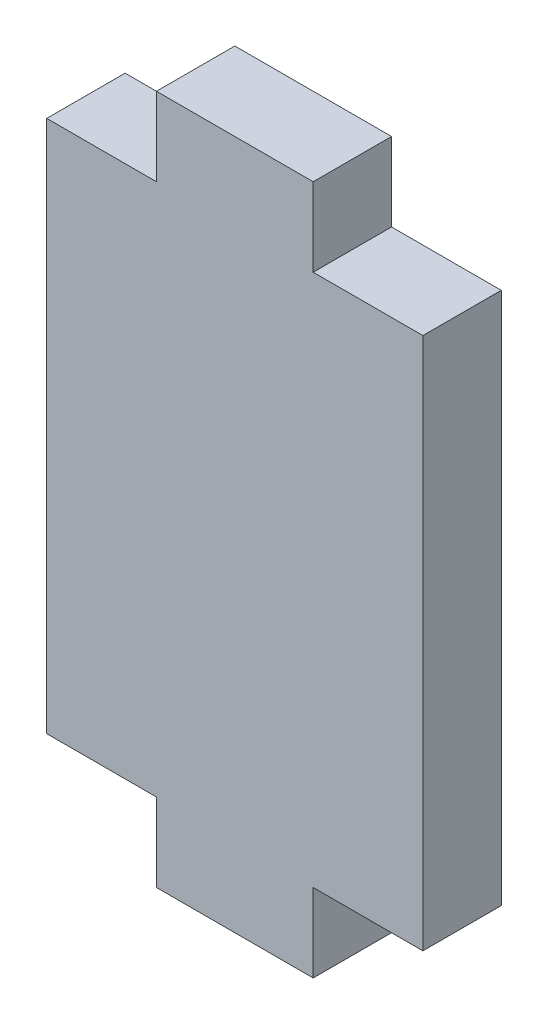
ISO-10303-21;
HEADER;
FILE_DESCRIPTION(('STEP AP214'),'2;1');
FILE_NAME('part.step','',(''),(''),'','','');
FILE_SCHEMA(('AUTOMOTIVE_DESIGN { 1 0 10303 214 1 1 1 1 }'));
ENDSEC;
DATA;
#1=APPLICATION_CONTEXT('core data for automotive mechanical design processes');
#2=APPLICATION_PROTOCOL_DEFINITION('international standard','automotive_design',2000,#1);
#3=PRODUCT_CONTEXT('',#1,'mechanical');
#4=PRODUCT('Part','Part','',(#3));
#5=PRODUCT_RELATED_PRODUCT_CATEGORY('part','',(#4));
#6=PRODUCT_DEFINITION_FORMATION('','',#4);
#7=PRODUCT_DEFINITION_CONTEXT('part definition',#1,'design');
#8=PRODUCT_DEFINITION('design','',#6,#7);
#9=PRODUCT_DEFINITION_SHAPE('','',#8);
#10=(LENGTH_UNIT() NAMED_UNIT(*) SI_UNIT(.MILLI.,.METRE.));
#11=(NAMED_UNIT(*) PLANE_ANGLE_UNIT() SI_UNIT($,.RADIAN.));
#12=(NAMED_UNIT(*) SI_UNIT($,.STERADIAN.) SOLID_ANGLE_UNIT());
#13=UNCERTAINTY_MEASURE_WITH_UNIT(LENGTH_MEASURE(1.E-05),#10,'distance_accuracy_value','');
#14=(GEOMETRIC_REPRESENTATION_CONTEXT(3) GLOBAL_UNCERTAINTY_ASSIGNED_CONTEXT((#13)) GLOBAL_UNIT_ASSIGNED_CONTEXT((#10,
#11,#12)) REPRESENTATION_CONTEXT('',''));
#15=CARTESIAN_POINT('',(0.,0.,0.));
#16=DIRECTION('',(0.,0.,1.));
#17=DIRECTION('',(1.,0.,0.));
#18=AXIS2_PLACEMENT_3D('',#15,#16,#17);
#19=CARTESIAN_POINT('',(24.,44.,10.));
#20=DIRECTION('',(-1.,0.,0.));
#21=DIRECTION('',(0.,-1.,0.));
#22=AXIS2_PLACEMENT_3D('',#19,#20,#21);
#23=PLANE('',#22);
#24=DIRECTION('',(0.,1.,0.));
#25=VECTOR('',#24,1.);
#26=CARTESIAN_POINT('',(24.,44.,10.));
#27=LINE('',#26,#25);
#28=CARTESIAN_POINT('',(24.,-34.,10.));
#29=VERTEX_POINT('',#28);
#30=CARTESIAN_POINT('',(24.,34.,10.));
#31=VERTEX_POINT('',#30);
#32=EDGE_CURVE('E149',#29,#31,#27,.T.);
#33=ORIENTED_EDGE('',*,*,#32,.F.);
#34=DIRECTION('',(0.,0.,-1.));
#35=VECTOR('',#34,1.);
#36=CARTESIAN_POINT('',(24.,-34.,10.));
#37=LINE('',#36,#35);
#38=CARTESIAN_POINT('',(24.,-34.,0.));
#39=VERTEX_POINT('',#38);
#40=EDGE_CURVE('E184',#29,#39,#37,.T.);
#41=ORIENTED_EDGE('',*,*,#40,.T.);
#42=DIRECTION('',(0.,1.,0.));
#43=VECTOR('',#42,1.);
#44=CARTESIAN_POINT('',(24.,44.,0.));
#45=LINE('',#44,#43);
#46=CARTESIAN_POINT('',(24.,34.,0.));
#47=VERTEX_POINT('',#46);
#48=EDGE_CURVE('E196',#39,#47,#45,.T.);
#49=ORIENTED_EDGE('',*,*,#48,.T.);
#50=DIRECTION('',(0.,0.,1.));
#51=VECTOR('',#50,1.);
#52=CARTESIAN_POINT('',(24.,34.,10.));
#53=LINE('',#52,#51);
#54=EDGE_CURVE('E182',#47,#31,#53,.T.);
#55=ORIENTED_EDGE('',*,*,#54,.T.);
#56=EDGE_LOOP('',(#33,#41,#49,#55));
#57=FACE_BOUND('',#56,.T.);
#58=ADVANCED_FACE('F33',(#57),#23,.F.);
#59=CARTESIAN_POINT('',(-24.,44.,10.));
#60=DIRECTION('',(0.,-1.,0.));
#61=DIRECTION('',(0.,0.,-1.));
#62=AXIS2_PLACEMENT_3D('',#59,#60,#61);
#63=PLANE('',#62);
#64=DIRECTION('',(-1.,0.,0.));
#65=VECTOR('',#64,1.);
#66=CARTESIAN_POINT('',(-24.,44.,10.));
#67=LINE('',#66,#65);
#68=CARTESIAN_POINT('',(10.,44.,10.));
#69=VERTEX_POINT('',#68);
#70=CARTESIAN_POINT('',(-10.,44.,10.));
#71=VERTEX_POINT('',#70);
#72=EDGE_CURVE('E198',#69,#71,#67,.T.);
#73=ORIENTED_EDGE('',*,*,#72,.F.);
#74=DIRECTION('',(0.,0.,-1.));
#75=VECTOR('',#74,1.);
#76=CARTESIAN_POINT('',(9.99999999999999,44.,10.));
#77=LINE('',#76,#75);
#78=CARTESIAN_POINT('',(10.,44.,0.));
#79=VERTEX_POINT('',#78);
#80=EDGE_CURVE('E129',#69,#79,#77,.T.);
#81=ORIENTED_EDGE('',*,*,#80,.T.);
#82=DIRECTION('',(-1.,0.,0.));
#83=VECTOR('',#82,1.);
#84=CARTESIAN_POINT('',(-24.,44.,0.));
#85=LINE('',#84,#83);
#86=CARTESIAN_POINT('',(-10.,44.,0.));
#87=VERTEX_POINT('',#86);
#88=EDGE_CURVE('E210',#79,#87,#85,.T.);
#89=ORIENTED_EDGE('',*,*,#88,.T.);
#90=DIRECTION('',(0.,0.,1.));
#91=VECTOR('',#90,1.);
#92=CARTESIAN_POINT('',(-10.,44.,10.));
#93=LINE('',#92,#91);
#94=EDGE_CURVE('E178',#87,#71,#93,.T.);
#95=ORIENTED_EDGE('',*,*,#94,.T.);
#96=EDGE_LOOP('',(#73,#81,#89,#95));
#97=FACE_BOUND('',#96,.T.);
#98=ADVANCED_FACE('F231',(#97),#63,.F.);
#99=CARTESIAN_POINT('',(-24.,44.,10.));
#100=DIRECTION('',(1.,0.,0.));
#101=DIRECTION('',(0.,1.,0.));
#102=AXIS2_PLACEMENT_3D('',#99,#100,#101);
#103=PLANE('',#102);
#104=DIRECTION('',(0.,-1.,0.));
#105=VECTOR('',#104,1.);
#106=CARTESIAN_POINT('',(-24.,44.,0.));
#107=LINE('',#106,#105);
#108=CARTESIAN_POINT('',(-24.,34.,0.));
#109=VERTEX_POINT('',#108);
#110=CARTESIAN_POINT('',(-24.,-34.,0.));
#111=VERTEX_POINT('',#110);
#112=EDGE_CURVE('E213',#109,#111,#107,.T.);
#113=ORIENTED_EDGE('',*,*,#112,.T.);
#114=DIRECTION('',(0.,0.,1.));
#115=VECTOR('',#114,1.);
#116=CARTESIAN_POINT('',(-24.,-34.,10.));
#117=LINE('',#116,#115);
#118=CARTESIAN_POINT('',(-24.,-34.,10.));
#119=VERTEX_POINT('',#118);
#120=EDGE_CURVE('E193',#111,#119,#117,.T.);
#121=ORIENTED_EDGE('',*,*,#120,.T.);
#122=DIRECTION('',(0.,-1.,0.));
#123=VECTOR('',#122,1.);
#124=CARTESIAN_POINT('',(-24.,44.,10.));
#125=LINE('',#124,#123);
#126=CARTESIAN_POINT('',(-24.,34.,10.));
#127=VERTEX_POINT('',#126);
#128=EDGE_CURVE('E201',#127,#119,#125,.T.);
#129=ORIENTED_EDGE('',*,*,#128,.F.);
#130=DIRECTION('',(0.,0.,-1.));
#131=VECTOR('',#130,1.);
#132=CARTESIAN_POINT('',(-24.,34.,10.));
#133=LINE('',#132,#131);
#134=EDGE_CURVE('E175',#127,#109,#133,.T.);
#135=ORIENTED_EDGE('',*,*,#134,.T.);
#136=EDGE_LOOP('',(#113,#121,#129,#135));
#137=FACE_BOUND('',#136,.T.);
#138=ADVANCED_FACE('F242',(#137),#103,.F.);
#139=CARTESIAN_POINT('',(-24.,-44.,10.));
#140=DIRECTION('',(0.,1.,0.));
#141=DIRECTION('',(0.,0.,1.));
#142=AXIS2_PLACEMENT_3D('',#139,#140,#141);
#143=PLANE('',#142);
#144=DIRECTION('',(1.,0.,0.));
#145=VECTOR('',#144,1.);
#146=CARTESIAN_POINT('',(-24.,-44.,10.));
#147=LINE('',#146,#145);
#148=CARTESIAN_POINT('',(-10.,-44.,10.));
#149=VERTEX_POINT('',#148);
#150=CARTESIAN_POINT('',(10.,-44.,10.));
#151=VERTEX_POINT('',#150);
#152=EDGE_CURVE('E204',#149,#151,#147,.T.);
#153=ORIENTED_EDGE('',*,*,#152,.F.);
#154=DIRECTION('',(0.,0.,-1.));
#155=VECTOR('',#154,1.);
#156=CARTESIAN_POINT('',(-10.,-44.,10.));
#157=LINE('',#156,#155);
#158=CARTESIAN_POINT('',(-10.,-44.,0.));
#159=VERTEX_POINT('',#158);
#160=EDGE_CURVE('E190',#149,#159,#157,.T.);
#161=ORIENTED_EDGE('',*,*,#160,.T.);
#162=DIRECTION('',(1.,0.,0.));
#163=VECTOR('',#162,1.);
#164=CARTESIAN_POINT('',(-24.,-44.,0.));
#165=LINE('',#164,#163);
#166=CARTESIAN_POINT('',(10.,-44.,0.));
#167=VERTEX_POINT('',#166);
#168=EDGE_CURVE('E199',#159,#167,#165,.T.);
#169=ORIENTED_EDGE('',*,*,#168,.T.);
#170=DIRECTION('',(0.,0.,1.));
#171=VECTOR('',#170,1.);
#172=CARTESIAN_POINT('',(10.,-44.,10.));
#173=LINE('',#172,#171);
#174=EDGE_CURVE('E187',#167,#151,#173,.T.);
#175=ORIENTED_EDGE('',*,*,#174,.T.);
#176=EDGE_LOOP('',(#153,#161,#169,#175));
#177=FACE_BOUND('',#176,.T.);
#178=ADVANCED_FACE('F249',(#177),#143,.F.);
#179=CARTESIAN_POINT('',(0.,0.,10.));
#180=DIRECTION('',(0.,0.,1.));
#181=DIRECTION('',(1.,0.,0.));
#182=AXIS2_PLACEMENT_3D('',#179,#180,#181);
#183=PLANE('',#182);
#184=DIRECTION('',(-1.,0.,0.));
#185=VECTOR('',#184,1.);
#186=CARTESIAN_POINT('',(-38.,-34.,10.));
#187=LINE('',#186,#185);
#188=CARTESIAN_POINT('',(-9.99999999999999,-34.,10.));
#189=VERTEX_POINT('',#188);
#190=EDGE_CURVE('E161',#189,#119,#187,.T.);
#191=ORIENTED_EDGE('',*,*,#190,.F.);
#192=DIRECTION('',(0.,1.,0.));
#193=VECTOR('',#192,1.);
#194=CARTESIAN_POINT('',(-10.,-54.,10.));
#195=LINE('',#194,#193);
#196=EDGE_CURVE('E162',#149,#189,#195,.T.);
#197=ORIENTED_EDGE('',*,*,#196,.F.);
#198=ORIENTED_EDGE('',*,*,#152,.T.);
#199=DIRECTION('',(0.,-1.,0.));
#200=VECTOR('',#199,1.);
#201=CARTESIAN_POINT('',(10.,-54.,10.));
#202=LINE('',#201,#200);
#203=CARTESIAN_POINT('',(10.,-34.,10.));
#204=VERTEX_POINT('',#203);
#205=EDGE_CURVE('E154',#204,#151,#202,.T.);
#206=ORIENTED_EDGE('',*,*,#205,.F.);
#207=DIRECTION('',(-1.,0.,0.));
#208=VECTOR('',#207,1.);
#209=CARTESIAN_POINT('',(38.,-34.,10.));
#210=LINE('',#209,#208);
#211=EDGE_CURVE('E155',#29,#204,#210,.T.);
#212=ORIENTED_EDGE('',*,*,#211,.F.);
#213=ORIENTED_EDGE('',*,*,#32,.T.);
#214=DIRECTION('',(1.,0.,0.));
#215=VECTOR('',#214,1.);
#216=CARTESIAN_POINT('',(38.,34.,10.));
#217=LINE('',#216,#215);
#218=CARTESIAN_POINT('',(10.,34.,10.));
#219=VERTEX_POINT('',#218);
#220=EDGE_CURVE('E134',#219,#31,#217,.T.);
#221=ORIENTED_EDGE('',*,*,#220,.F.);
#222=DIRECTION('',(0.,-1.,0.));
#223=VECTOR('',#222,1.);
#224=CARTESIAN_POINT('',(9.99999999999999,54.,10.));
#225=LINE('',#224,#223);
#226=EDGE_CURVE('E123',#69,#219,#225,.T.);
#227=ORIENTED_EDGE('',*,*,#226,.F.);
#228=ORIENTED_EDGE('',*,*,#72,.T.);
#229=DIRECTION('',(0.,1.,0.));
#230=VECTOR('',#229,1.);
#231=CARTESIAN_POINT('',(-10.,54.,10.));
#232=LINE('',#231,#230);
#233=CARTESIAN_POINT('',(-9.99999999999999,34.,10.));
#234=VERTEX_POINT('',#233);
#235=EDGE_CURVE('E142',#234,#71,#232,.T.);
#236=ORIENTED_EDGE('',*,*,#235,.F.);
#237=DIRECTION('',(1.,0.,0.));
#238=VECTOR('',#237,1.);
#239=CARTESIAN_POINT('',(-38.,34.,10.));
#240=LINE('',#239,#238);
#241=EDGE_CURVE('E170',#127,#234,#240,.T.);
#242=ORIENTED_EDGE('',*,*,#241,.F.);
#243=ORIENTED_EDGE('',*,*,#128,.T.);
#244=EDGE_LOOP('',(#191,#197,#198,#206,#212,#213,#221,#227,#228,#236,#242,#243));
#245=FACE_BOUND('',#244,.T.);
#246=ADVANCED_FACE('F146',(#245),#183,.T.);
#247=CARTESIAN_POINT('',(0.,0.,0.));
#248=DIRECTION('',(0.,0.,1.));
#249=DIRECTION('',(1.,0.,0.));
#250=AXIS2_PLACEMENT_3D('',#247,#248,#249);
#251=PLANE('',#250);
#252=DIRECTION('',(0.,1.,0.));
#253=VECTOR('',#252,1.);
#254=CARTESIAN_POINT('',(-9.99999999999999,0.,0.));
#255=LINE('',#254,#253);
#256=CARTESIAN_POINT('',(-9.99999999999999,-34.,0.));
#257=VERTEX_POINT('',#256);
#258=EDGE_CURVE('E11',#159,#257,#255,.T.);
#259=ORIENTED_EDGE('',*,*,#258,.T.);
#260=DIRECTION('',(-1.,0.,0.));
#261=VECTOR('',#260,1.);
#262=CARTESIAN_POINT('',(-38.,-34.,0.));
#263=LINE('',#262,#261);
#264=EDGE_CURVE('E47',#257,#111,#263,.T.);
#265=ORIENTED_EDGE('',*,*,#264,.T.);
#266=ORIENTED_EDGE('',*,*,#112,.F.);
#267=DIRECTION('',(1.,0.,0.));
#268=VECTOR('',#267,1.);
#269=CARTESIAN_POINT('',(0.,34.,0.));
#270=LINE('',#269,#268);
#271=CARTESIAN_POINT('',(-9.99999999999999,34.,0.));
#272=VERTEX_POINT('',#271);
#273=EDGE_CURVE('E207',#109,#272,#270,.T.);
#274=ORIENTED_EDGE('',*,*,#273,.T.);
#275=DIRECTION('',(0.,1.,0.));
#276=VECTOR('',#275,1.);
#277=CARTESIAN_POINT('',(-10.,54.,0.));
#278=LINE('',#277,#276);
#279=EDGE_CURVE('E166',#272,#87,#278,.T.);
#280=ORIENTED_EDGE('',*,*,#279,.T.);
#281=ORIENTED_EDGE('',*,*,#88,.F.);
#282=DIRECTION('',(0.,-1.,0.));
#283=VECTOR('',#282,1.);
#284=CARTESIAN_POINT('',(10.,0.,0.));
#285=LINE('',#284,#283);
#286=CARTESIAN_POINT('',(10.,34.,0.));
#287=VERTEX_POINT('',#286);
#288=EDGE_CURVE('E220',#79,#287,#285,.T.);
#289=ORIENTED_EDGE('',*,*,#288,.T.);
#290=DIRECTION('',(1.,0.,0.));
#291=VECTOR('',#290,1.);
#292=CARTESIAN_POINT('',(38.,34.,0.));
#293=LINE('',#292,#291);
#294=EDGE_CURVE('E141',#287,#47,#293,.T.);
#295=ORIENTED_EDGE('',*,*,#294,.T.);
#296=ORIENTED_EDGE('',*,*,#48,.F.);
#297=DIRECTION('',(-1.,0.,0.));
#298=VECTOR('',#297,1.);
#299=CARTESIAN_POINT('',(0.,-34.,0.));
#300=LINE('',#299,#298);
#301=CARTESIAN_POINT('',(10.,-34.,0.));
#302=VERTEX_POINT('',#301);
#303=EDGE_CURVE('E40',#39,#302,#300,.T.);
#304=ORIENTED_EDGE('',*,*,#303,.T.);
#305=DIRECTION('',(0.,-1.,0.));
#306=VECTOR('',#305,1.);
#307=CARTESIAN_POINT('',(10.,-54.,0.));
#308=LINE('',#307,#306);
#309=EDGE_CURVE('E55',#302,#167,#308,.T.);
#310=ORIENTED_EDGE('',*,*,#309,.T.);
#311=ORIENTED_EDGE('',*,*,#168,.F.);
#312=EDGE_LOOP('',(#259,#265,#266,#274,#280,#281,#289,#295,#296,#304,#310,#311));
#313=FACE_BOUND('',#312,.T.);
#314=ADVANCED_FACE('F224',(#313),#251,.F.);
#315=CARTESIAN_POINT('',(-10.,54.,0.));
#316=DIRECTION('',(1.,0.,0.));
#317=DIRECTION('',(0.,1.,0.));
#318=AXIS2_PLACEMENT_3D('',#315,#316,#317);
#319=PLANE('',#318);
#320=ORIENTED_EDGE('',*,*,#279,.F.);
#321=DIRECTION('',(0.,0.,1.));
#322=VECTOR('',#321,1.);
#323=CARTESIAN_POINT('',(-9.99999999999999,34.,0.));
#324=LINE('',#323,#322);
#325=EDGE_CURVE('E169',#272,#234,#324,.T.);
#326=ORIENTED_EDGE('',*,*,#325,.T.);
#327=ORIENTED_EDGE('',*,*,#235,.T.);
#328=ORIENTED_EDGE('',*,*,#94,.F.);
#329=EDGE_LOOP('',(#320,#326,#327,#328));
#330=FACE_BOUND('',#329,.T.);
#331=ADVANCED_FACE('F236',(#330),#319,.F.);
#332=CARTESIAN_POINT('',(-38.,34.,0.));
#333=DIRECTION('',(0.,-1.,0.));
#334=DIRECTION('',(0.,0.,-1.));
#335=AXIS2_PLACEMENT_3D('',#332,#333,#334);
#336=PLANE('',#335);
#337=ORIENTED_EDGE('',*,*,#241,.T.);
#338=ORIENTED_EDGE('',*,*,#325,.F.);
#339=ORIENTED_EDGE('',*,*,#273,.F.);
#340=ORIENTED_EDGE('',*,*,#134,.F.);
#341=EDGE_LOOP('',(#337,#338,#339,#340));
#342=FACE_BOUND('',#341,.T.);
#343=ADVANCED_FACE('F239',(#342),#336,.F.);
#344=CARTESIAN_POINT('',(38.,34.,0.));
#345=DIRECTION('',(0.,-1.,0.));
#346=DIRECTION('',(1.,0.,0.));
#347=AXIS2_PLACEMENT_3D('',#344,#345,#346);
#348=PLANE('',#347);
#349=ORIENTED_EDGE('',*,*,#294,.F.);
#350=DIRECTION('',(0.,0.,1.));
#351=VECTOR('',#350,1.);
#352=CARTESIAN_POINT('',(10.,34.,0.));
#353=LINE('',#352,#351);
#354=EDGE_CURVE('E126',#287,#219,#353,.T.);
#355=ORIENTED_EDGE('',*,*,#354,.T.);
#356=ORIENTED_EDGE('',*,*,#220,.T.);
#357=ORIENTED_EDGE('',*,*,#54,.F.);
#358=EDGE_LOOP('',(#349,#355,#356,#357));
#359=FACE_BOUND('',#358,.T.);
#360=ADVANCED_FACE('F138',(#359),#348,.F.);
#361=CARTESIAN_POINT('',(9.99999999999999,54.,0.));
#362=DIRECTION('',(-1.,0.,0.));
#363=DIRECTION('',(0.,-1.,0.));
#364=AXIS2_PLACEMENT_3D('',#361,#362,#363);
#365=PLANE('',#364);
#366=ORIENTED_EDGE('',*,*,#226,.T.);
#367=ORIENTED_EDGE('',*,*,#354,.F.);
#368=ORIENTED_EDGE('',*,*,#288,.F.);
#369=ORIENTED_EDGE('',*,*,#80,.F.);
#370=EDGE_LOOP('',(#366,#367,#368,#369));
#371=FACE_BOUND('',#370,.T.);
#372=ADVANCED_FACE('F125',(#371),#365,.F.);
#373=CARTESIAN_POINT('',(10.,-54.,0.));
#374=DIRECTION('',(-1.,0.,0.));
#375=DIRECTION('',(0.,-1.,0.));
#376=AXIS2_PLACEMENT_3D('',#373,#374,#375);
#377=PLANE('',#376);
#378=ORIENTED_EDGE('',*,*,#309,.F.);
#379=DIRECTION('',(0.,0.,1.));
#380=VECTOR('',#379,1.);
#381=CARTESIAN_POINT('',(10.,-34.,0.));
#382=LINE('',#381,#380);
#383=EDGE_CURVE('E135',#302,#204,#382,.T.);
#384=ORIENTED_EDGE('',*,*,#383,.T.);
#385=ORIENTED_EDGE('',*,*,#205,.T.);
#386=ORIENTED_EDGE('',*,*,#174,.F.);
#387=EDGE_LOOP('',(#378,#384,#385,#386));
#388=FACE_BOUND('',#387,.T.);
#389=ADVANCED_FACE('F251',(#388),#377,.F.);
#390=CARTESIAN_POINT('',(38.,-34.,0.));
#391=DIRECTION('',(0.,1.,0.));
#392=DIRECTION('',(-1.,0.,0.));
#393=AXIS2_PLACEMENT_3D('',#390,#391,#392);
#394=PLANE('',#393);
#395=ORIENTED_EDGE('',*,*,#211,.T.);
#396=ORIENTED_EDGE('',*,*,#383,.F.);
#397=ORIENTED_EDGE('',*,*,#303,.F.);
#398=ORIENTED_EDGE('',*,*,#40,.F.);
#399=EDGE_LOOP('',(#395,#396,#397,#398));
#400=FACE_BOUND('',#399,.T.);
#401=ADVANCED_FACE('F227',(#400),#394,.F.);
#402=CARTESIAN_POINT('',(-38.,-34.,0.));
#403=DIRECTION('',(0.,1.,0.));
#404=DIRECTION('',(0.,0.,1.));
#405=AXIS2_PLACEMENT_3D('',#402,#403,#404);
#406=PLANE('',#405);
#407=ORIENTED_EDGE('',*,*,#264,.F.);
#408=DIRECTION('',(0.,0.,1.));
#409=VECTOR('',#408,1.);
#410=CARTESIAN_POINT('',(-9.99999999999999,-34.,0.));
#411=LINE('',#410,#409);
#412=EDGE_CURVE('E157',#257,#189,#411,.T.);
#413=ORIENTED_EDGE('',*,*,#412,.T.);
#414=ORIENTED_EDGE('',*,*,#190,.T.);
#415=ORIENTED_EDGE('',*,*,#120,.F.);
#416=EDGE_LOOP('',(#407,#413,#414,#415));
#417=FACE_BOUND('',#416,.T.);
#418=ADVANCED_FACE('F245',(#417),#406,.F.);
#419=CARTESIAN_POINT('',(-10.,-54.,0.));
#420=DIRECTION('',(1.,0.,0.));
#421=DIRECTION('',(0.,1.,0.));
#422=AXIS2_PLACEMENT_3D('',#419,#420,#421);
#423=PLANE('',#422);
#424=ORIENTED_EDGE('',*,*,#196,.T.);
#425=ORIENTED_EDGE('',*,*,#412,.F.);
#426=ORIENTED_EDGE('',*,*,#258,.F.);
#427=ORIENTED_EDGE('',*,*,#160,.F.);
#428=EDGE_LOOP('',(#424,#425,#426,#427));
#429=FACE_BOUND('',#428,.T.);
#430=ADVANCED_FACE('F247',(#429),#423,.F.);
#431=CLOSED_SHELL('',(#58,#98,#138,#178,#246,#314,#331,#343,#360,#372,#389,#401,#418,#430));
#432=MANIFOLD_SOLID_BREP('B2',#431);
#433=ADVANCED_BREP_SHAPE_REPRESENTATION('',(#18,#432),#14);
#434=SHAPE_DEFINITION_REPRESENTATION(#9,#433);
ENDSEC;
END-ISO-10303-21;
